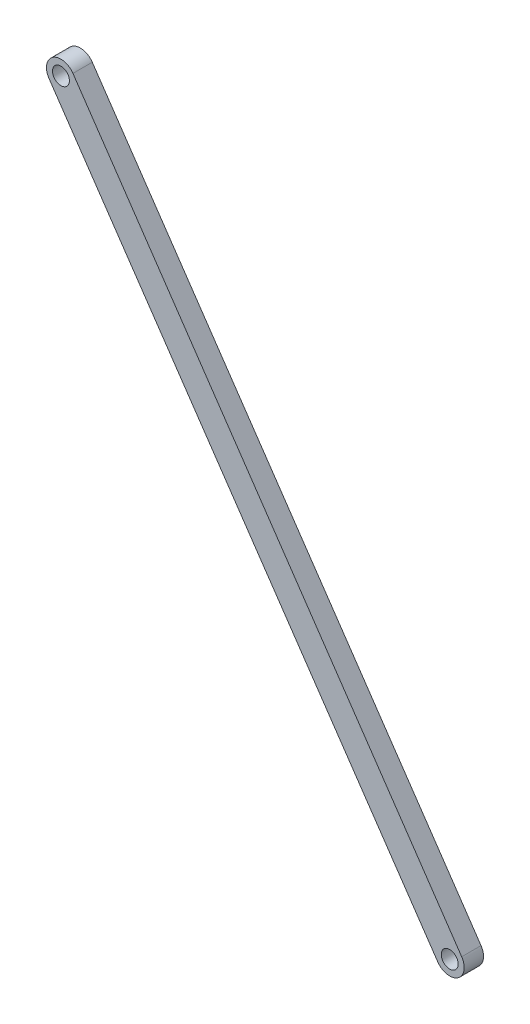
ISO-10303-21;
HEADER;
FILE_DESCRIPTION(('STEP AP214'),'2;1');
FILE_NAME('part.step','',(''),(''),'','','');
FILE_SCHEMA(('AUTOMOTIVE_DESIGN { 1 0 10303 214 1 1 1 1 }'));
ENDSEC;
DATA;
#1=APPLICATION_CONTEXT('core data for automotive mechanical design processes');
#2=APPLICATION_PROTOCOL_DEFINITION('international standard','automotive_design',2000,#1);
#3=PRODUCT_CONTEXT('',#1,'mechanical');
#4=PRODUCT('Part','Part','',(#3));
#5=PRODUCT_RELATED_PRODUCT_CATEGORY('part','',(#4));
#6=PRODUCT_DEFINITION_FORMATION('','',#4);
#7=PRODUCT_DEFINITION_CONTEXT('part definition',#1,'design');
#8=PRODUCT_DEFINITION('design','',#6,#7);
#9=PRODUCT_DEFINITION_SHAPE('','',#8);
#10=(LENGTH_UNIT() NAMED_UNIT(*) SI_UNIT(.MILLI.,.METRE.));
#11=(NAMED_UNIT(*) PLANE_ANGLE_UNIT() SI_UNIT($,.RADIAN.));
#12=(NAMED_UNIT(*) SI_UNIT($,.STERADIAN.) SOLID_ANGLE_UNIT());
#13=UNCERTAINTY_MEASURE_WITH_UNIT(LENGTH_MEASURE(1.E-05),#10,'distance_accuracy_value','');
#14=(GEOMETRIC_REPRESENTATION_CONTEXT(3) GLOBAL_UNCERTAINTY_ASSIGNED_CONTEXT((#13)) GLOBAL_UNIT_ASSIGNED_CONTEXT((#10,
#11,#12)) REPRESENTATION_CONTEXT('',''));
#15=CARTESIAN_POINT('',(0.,0.,0.));
#16=DIRECTION('',(0.,0.,1.));
#17=DIRECTION('',(1.,0.,0.));
#18=AXIS2_PLACEMENT_3D('',#15,#16,#17);
#19=CARTESIAN_POINT('',(55.7151074833627,-262.605554010477,4.));
#20=DIRECTION('',(0.,0.,1.));
#21=DIRECTION('',(1.,0.,0.));
#22=AXIS2_PLACEMENT_3D('',#19,#20,#21);
#23=PLANE('',#22);
#24=CARTESIAN_POINT('',(-24.6696992839401,-144.605554010477,4.));
#25=DIRECTION('',(0.,0.,-1.));
#26=DIRECTION('',(-1.,0.,0.));
#27=AXIS2_PLACEMENT_3D('',#24,#25,#26);
#28=CIRCLE('',#27,1.75000000646605);
#29=CARTESIAN_POINT('',(-26.4196992904061,-144.605554010477,4.));
#30=VERTEX_POINT('',#29);
#31=EDGE_CURVE('E122',#30,#30,#28,.T.);
#32=ORIENTED_EDGE('',*,*,#31,.T.);
#33=EDGE_LOOP('',(#32));
#34=FACE_BOUND('',#33,.T.);
#35=CARTESIAN_POINT('',(55.7151074833627,-262.605554010477,4.));
#36=DIRECTION('',(0.,0.,1.));
#37=DIRECTION('',(1.,0.,0.));
#38=AXIS2_PLACEMENT_3D('',#35,#36,#37);
#39=CIRCLE('',#38,1.75);
#40=CARTESIAN_POINT('',(57.4651074833627,-262.605554010477,4.));
#41=VERTEX_POINT('',#40);
#42=EDGE_CURVE('E107',#41,#41,#39,.T.);
#43=ORIENTED_EDGE('',*,*,#42,.F.);
#44=EDGE_LOOP('',(#43));
#45=FACE_BOUND('',#44,.T.);
#46=CARTESIAN_POINT('',(55.7151074833627,-262.605554010477,4.));
#47=DIRECTION('',(0.,0.,1.));
#48=DIRECTION('',(1.,0.,0.));
#49=AXIS2_PLACEMENT_3D('',#46,#47,#48);
#50=CIRCLE('',#49,2.99999999999996);
#51=CARTESIAN_POINT('',(53.2357436326678,-264.294564044748,4.));
#52=VERTEX_POINT('',#51);
#53=CARTESIAN_POINT('',(58.1944713340576,-260.916543976206,4.));
#54=VERTEX_POINT('',#53);
#55=EDGE_CURVE('E92',#52,#54,#50,.T.);
#56=ORIENTED_EDGE('',*,*,#55,.T.);
#57=DIRECTION('',(-0.563003344756913,0.826454616898308,0.));
#58=VECTOR('',#57,1.);
#59=CARTESIAN_POINT('',(58.1944713340576,-260.916543976206,4.));
#60=LINE('',#59,#58);
#61=CARTESIAN_POINT('',(-22.1903354332452,-142.916543976206,4.));
#62=VERTEX_POINT('',#61);
#63=EDGE_CURVE('E88',#54,#62,#60,.T.);
#64=ORIENTED_EDGE('',*,*,#63,.T.);
#65=CARTESIAN_POINT('',(-24.6696992839401,-144.605554010477,4.));
#66=DIRECTION('',(0.,0.,1.));
#67=DIRECTION('',(1.,0.,0.));
#68=AXIS2_PLACEMENT_3D('',#65,#66,#67);
#69=CIRCLE('',#68,2.99999999999992);
#70=CARTESIAN_POINT('',(-27.149063134635,-146.294564044748,4.));
#71=VERTEX_POINT('',#70);
#72=EDGE_CURVE('E90',#62,#71,#69,.T.);
#73=ORIENTED_EDGE('',*,*,#72,.T.);
#74=DIRECTION('',(0.563003344756913,-0.826454616898308,0.));
#75=VECTOR('',#74,1.);
#76=CARTESIAN_POINT('',(53.2357436326678,-264.294564044748,4.));
#77=LINE('',#76,#75);
#78=EDGE_CURVE('E58',#71,#52,#77,.T.);
#79=ORIENTED_EDGE('',*,*,#78,.T.);
#80=EDGE_LOOP('',(#56,#64,#73,#79));
#81=FACE_BOUND('',#80,.T.);
#82=ADVANCED_FACE('F41',(#34,#45,#81),#23,.T.);
#83=CARTESIAN_POINT('',(55.7151074833627,-262.605554010477,0.));
#84=DIRECTION('',(0.,0.,1.));
#85=DIRECTION('',(1.,0.,0.));
#86=AXIS2_PLACEMENT_3D('',#83,#84,#85);
#87=PLANE('',#86);
#88=CARTESIAN_POINT('',(-24.6696992839401,-144.605554010477,0.));
#89=DIRECTION('',(0.,0.,-1.));
#90=DIRECTION('',(-1.,0.,0.));
#91=AXIS2_PLACEMENT_3D('',#88,#89,#90);
#92=CIRCLE('',#91,1.75000000646605);
#93=CARTESIAN_POINT('',(-26.4196992904061,-144.605554010477,0.));
#94=VERTEX_POINT('',#93);
#95=EDGE_CURVE('E125',#94,#94,#92,.T.);
#96=ORIENTED_EDGE('',*,*,#95,.F.);
#97=EDGE_LOOP('',(#96));
#98=FACE_BOUND('',#97,.T.);
#99=CARTESIAN_POINT('',(55.7151074833627,-262.605554010477,0.));
#100=DIRECTION('',(0.,0.,1.));
#101=DIRECTION('',(1.,0.,0.));
#102=AXIS2_PLACEMENT_3D('',#99,#100,#101);
#103=CIRCLE('',#102,2.99999999999996);
#104=CARTESIAN_POINT('',(53.2357436326678,-264.294564044748,0.));
#105=VERTEX_POINT('',#104);
#106=CARTESIAN_POINT('',(58.1944713340576,-260.916543976206,0.));
#107=VERTEX_POINT('',#106);
#108=EDGE_CURVE('E104',#105,#107,#103,.T.);
#109=ORIENTED_EDGE('',*,*,#108,.F.);
#110=DIRECTION('',(0.563003344756913,-0.826454616898308,0.));
#111=VECTOR('',#110,1.);
#112=CARTESIAN_POINT('',(53.2357436326678,-264.294564044748,0.));
#113=LINE('',#112,#111);
#114=CARTESIAN_POINT('',(-27.149063134635,-146.294564044748,0.));
#115=VERTEX_POINT('',#114);
#116=EDGE_CURVE('E81',#115,#105,#113,.T.);
#117=ORIENTED_EDGE('',*,*,#116,.F.);
#118=CARTESIAN_POINT('',(-24.6696992839401,-144.605554010477,0.));
#119=DIRECTION('',(0.,0.,1.));
#120=DIRECTION('',(1.,0.,0.));
#121=AXIS2_PLACEMENT_3D('',#118,#119,#120);
#122=CIRCLE('',#121,2.99999999999992);
#123=CARTESIAN_POINT('',(-22.1903354332452,-142.916543976206,0.));
#124=VERTEX_POINT('',#123);
#125=EDGE_CURVE('E75',#124,#115,#122,.T.);
#126=ORIENTED_EDGE('',*,*,#125,.F.);
#127=DIRECTION('',(-0.563003344756913,0.826454616898308,0.));
#128=VECTOR('',#127,1.);
#129=CARTESIAN_POINT('',(58.1944713340576,-260.916543976206,0.));
#130=LINE('',#129,#128);
#131=EDGE_CURVE('E96',#107,#124,#130,.T.);
#132=ORIENTED_EDGE('',*,*,#131,.F.);
#133=EDGE_LOOP('',(#109,#117,#126,#132));
#134=FACE_BOUND('',#133,.T.);
#135=CARTESIAN_POINT('',(55.7151074833627,-262.605554010477,0.));
#136=DIRECTION('',(0.,0.,1.));
#137=DIRECTION('',(1.,0.,0.));
#138=AXIS2_PLACEMENT_3D('',#135,#136,#137);
#139=CIRCLE('',#138,1.75);
#140=CARTESIAN_POINT('',(57.4651074833627,-262.605554010477,0.));
#141=VERTEX_POINT('',#140);
#142=EDGE_CURVE('E119',#141,#141,#139,.T.);
#143=ORIENTED_EDGE('',*,*,#142,.T.);
#144=EDGE_LOOP('',(#143));
#145=FACE_BOUND('',#144,.T.);
#146=ADVANCED_FACE('F115',(#98,#134,#145),#87,.F.);
#147=CARTESIAN_POINT('',(55.7151074833627,-262.605554010477,4.));
#148=DIRECTION('',(0.,0.,-1.));
#149=DIRECTION('',(-1.,0.,0.));
#150=AXIS2_PLACEMENT_3D('',#147,#148,#149);
#151=CYLINDRICAL_SURFACE('',#150,2.99999999999996);
#152=ORIENTED_EDGE('',*,*,#108,.T.);
#153=DIRECTION('',(0.,0.,-1.));
#154=VECTOR('',#153,1.);
#155=CARTESIAN_POINT('',(58.1944713340576,-260.916543976206,4.));
#156=LINE('',#155,#154);
#157=EDGE_CURVE('E11',#54,#107,#156,.T.);
#158=ORIENTED_EDGE('',*,*,#157,.F.);
#159=ORIENTED_EDGE('',*,*,#55,.F.);
#160=DIRECTION('',(0.,0.,-1.));
#161=VECTOR('',#160,1.);
#162=CARTESIAN_POINT('',(53.2357436326678,-264.294564044748,4.));
#163=LINE('',#162,#161);
#164=EDGE_CURVE('E100',#52,#105,#163,.T.);
#165=ORIENTED_EDGE('',*,*,#164,.T.);
#166=EDGE_LOOP('',(#152,#158,#159,#165));
#167=FACE_BOUND('',#166,.T.);
#168=ADVANCED_FACE('F43',(#167),#151,.T.);
#169=CARTESIAN_POINT('',(58.1944713340576,-260.916543976206,4.));
#170=DIRECTION('',(-0.826454616898308,-0.563003344756913,0.));
#171=DIRECTION('',(0.563003344756913,-0.826454616898308,0.));
#172=AXIS2_PLACEMENT_3D('',#169,#170,#171);
#173=PLANE('',#172);
#174=ORIENTED_EDGE('',*,*,#131,.T.);
#175=DIRECTION('',(0.,0.,-1.));
#176=VECTOR('',#175,1.);
#177=CARTESIAN_POINT('',(-22.1903354332452,-142.916543976206,4.));
#178=LINE('',#177,#176);
#179=EDGE_CURVE('E50',#62,#124,#178,.T.);
#180=ORIENTED_EDGE('',*,*,#179,.F.);
#181=ORIENTED_EDGE('',*,*,#63,.F.);
#182=ORIENTED_EDGE('',*,*,#157,.T.);
#183=EDGE_LOOP('',(#174,#180,#181,#182));
#184=FACE_BOUND('',#183,.T.);
#185=ADVANCED_FACE('F95',(#184),#173,.F.);
#186=CARTESIAN_POINT('',(-24.6696992839401,-144.605554010477,4.));
#187=DIRECTION('',(0.,0.,-1.));
#188=DIRECTION('',(-1.,0.,0.));
#189=AXIS2_PLACEMENT_3D('',#186,#187,#188);
#190=CYLINDRICAL_SURFACE('',#189,2.99999999999992);
#191=ORIENTED_EDGE('',*,*,#125,.T.);
#192=DIRECTION('',(0.,0.,-1.));
#193=VECTOR('',#192,1.);
#194=CARTESIAN_POINT('',(-27.149063134635,-146.294564044748,4.));
#195=LINE('',#194,#193);
#196=EDGE_CURVE('E97',#71,#115,#195,.T.);
#197=ORIENTED_EDGE('',*,*,#196,.F.);
#198=ORIENTED_EDGE('',*,*,#72,.F.);
#199=ORIENTED_EDGE('',*,*,#179,.T.);
#200=EDGE_LOOP('',(#191,#197,#198,#199));
#201=FACE_BOUND('',#200,.T.);
#202=ADVANCED_FACE('F98',(#201),#190,.T.);
#203=CARTESIAN_POINT('',(53.2357436326678,-264.294564044748,4.));
#204=DIRECTION('',(0.826454616898308,0.563003344756913,0.));
#205=DIRECTION('',(-0.563003344756913,0.826454616898308,0.));
#206=AXIS2_PLACEMENT_3D('',#203,#204,#205);
#207=PLANE('',#206);
#208=ORIENTED_EDGE('',*,*,#116,.T.);
#209=ORIENTED_EDGE('',*,*,#164,.F.);
#210=ORIENTED_EDGE('',*,*,#78,.F.);
#211=ORIENTED_EDGE('',*,*,#196,.T.);
#212=EDGE_LOOP('',(#208,#209,#210,#211));
#213=FACE_BOUND('',#212,.T.);
#214=ADVANCED_FACE('F112',(#213),#207,.F.);
#215=CARTESIAN_POINT('',(55.7151074833627,-262.605554010477,4.));
#216=DIRECTION('',(0.,0.,-1.));
#217=DIRECTION('',(-1.,0.,0.));
#218=AXIS2_PLACEMENT_3D('',#215,#216,#217);
#219=CYLINDRICAL_SURFACE('',#218,1.75);
#220=ORIENTED_EDGE('',*,*,#42,.T.);
#221=EDGE_LOOP('',(#220));
#222=FACE_BOUND('',#221,.T.);
#223=ORIENTED_EDGE('',*,*,#142,.F.);
#224=EDGE_LOOP('',(#223));
#225=FACE_BOUND('',#224,.T.);
#226=ADVANCED_FACE('F136',(#222,#225),#219,.F.);
#227=CARTESIAN_POINT('',(-24.6696992839401,-144.605554010477,4.));
#228=DIRECTION('',(0.,0.,-1.));
#229=DIRECTION('',(-1.,0.,0.));
#230=AXIS2_PLACEMENT_3D('',#227,#228,#229);
#231=CYLINDRICAL_SURFACE('',#230,1.75000000646605);
#232=ORIENTED_EDGE('',*,*,#31,.F.);
#233=EDGE_LOOP('',(#232));
#234=FACE_BOUND('',#233,.T.);
#235=ORIENTED_EDGE('',*,*,#95,.T.);
#236=EDGE_LOOP('',(#235));
#237=FACE_BOUND('',#236,.T.);
#238=ADVANCED_FACE('F133',(#234,#237),#231,.F.);
#239=CLOSED_SHELL('',(#82,#146,#168,#185,#202,#214,#226,#238));
#240=MANIFOLD_SOLID_BREP('B2',#239);
#241=ADVANCED_BREP_SHAPE_REPRESENTATION('',(#18,#240),#14);
#242=SHAPE_DEFINITION_REPRESENTATION(#9,#241);
ENDSEC;
END-ISO-10303-21;
